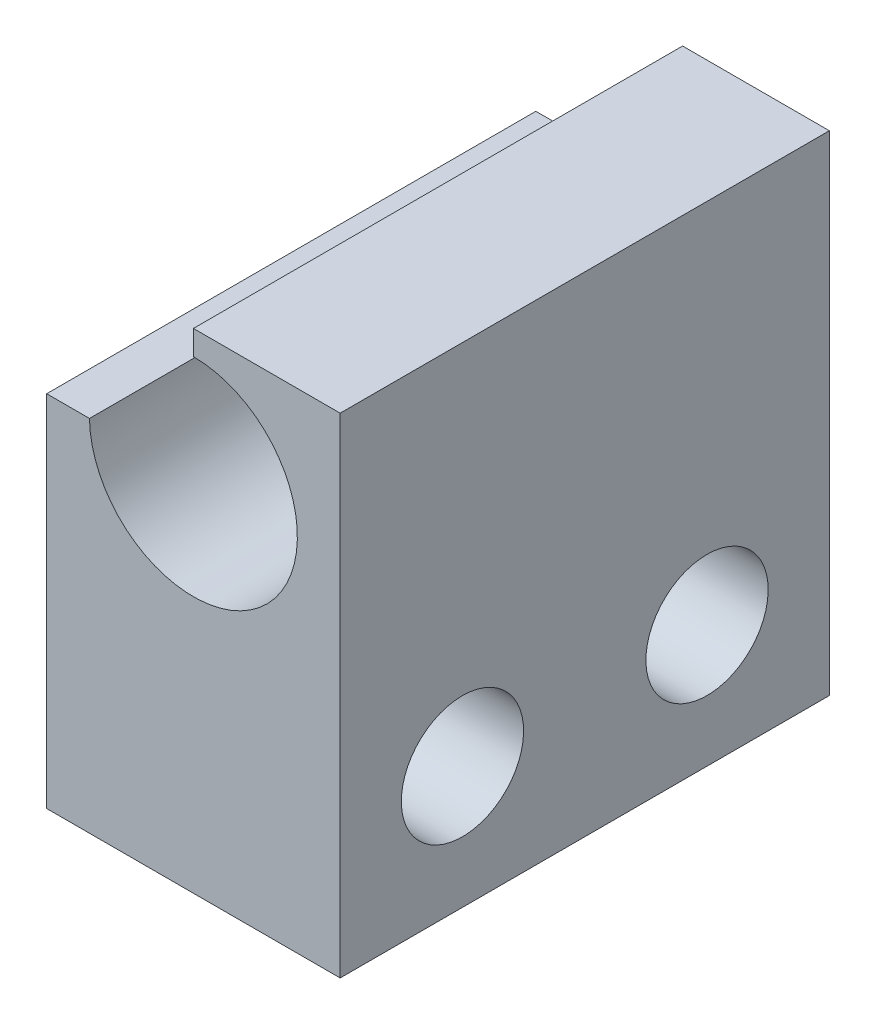
ISO-10303-21;
HEADER;
FILE_DESCRIPTION(('STEP AP214'),'2;1');
FILE_NAME('part.step','',(''),(''),'','','');
FILE_SCHEMA(('AUTOMOTIVE_DESIGN { 1 0 10303 214 1 1 1 1 }'));
ENDSEC;
DATA;
#1=APPLICATION_CONTEXT('core data for automotive mechanical design processes');
#2=APPLICATION_PROTOCOL_DEFINITION('international standard','automotive_design',2000,#1);
#3=PRODUCT_CONTEXT('',#1,'mechanical');
#4=PRODUCT('Part','Part','',(#3));
#5=PRODUCT_RELATED_PRODUCT_CATEGORY('part','',(#4));
#6=PRODUCT_DEFINITION_FORMATION('','',#4);
#7=PRODUCT_DEFINITION_CONTEXT('part definition',#1,'design');
#8=PRODUCT_DEFINITION('design','',#6,#7);
#9=PRODUCT_DEFINITION_SHAPE('','',#8);
#10=(LENGTH_UNIT() NAMED_UNIT(*) SI_UNIT(.MILLI.,.METRE.));
#11=(NAMED_UNIT(*) PLANE_ANGLE_UNIT() SI_UNIT($,.RADIAN.));
#12=(NAMED_UNIT(*) SI_UNIT($,.STERADIAN.) SOLID_ANGLE_UNIT());
#13=UNCERTAINTY_MEASURE_WITH_UNIT(LENGTH_MEASURE(1.E-05),#10,'distance_accuracy_value','');
#14=(GEOMETRIC_REPRESENTATION_CONTEXT(3) GLOBAL_UNCERTAINTY_ASSIGNED_CONTEXT((#13)) GLOBAL_UNIT_ASSIGNED_CONTEXT((#10,
#11,#12)) REPRESENTATION_CONTEXT('',''));
#15=CARTESIAN_POINT('',(0.,0.,0.));
#16=DIRECTION('',(0.,0.,1.));
#17=DIRECTION('',(1.,0.,0.));
#18=AXIS2_PLACEMENT_3D('',#15,#16,#17);
#19=CARTESIAN_POINT('',(-3.61398782119335,10.7259622854869,25.4));
#20=DIRECTION('',(0.,0.,-1.));
#21=DIRECTION('',(-1.,0.,0.));
#22=AXIS2_PLACEMENT_3D('',#19,#20,#21);
#23=CYLINDRICAL_SURFACE('',#22,5.3975);
#24=CARTESIAN_POINT('',(-3.61398782119335,10.7259622854869,0.));
#25=DIRECTION('',(0.,0.,-1.));
#26=DIRECTION('',(1.,0.,0.));
#27=AXIS2_PLACEMENT_3D('',#24,#25,#26);
#28=CIRCLE('',#27,5.3975);
#29=CARTESIAN_POINT('',(-3.61398782119336,16.1234622854869,0.));
#30=VERTEX_POINT('',#29);
#31=CARTESIAN_POINT('',(-9.01092004822007,10.647675716521,0.));
#32=VERTEX_POINT('',#31);
#33=EDGE_CURVE('E128',#30,#32,#28,.T.);
#34=ORIENTED_EDGE('',*,*,#33,.T.);
#35=DIRECTION('',(0.,0.,-1.));
#36=VECTOR('',#35,1.);
#37=CARTESIAN_POINT('',(-9.01092004822007,10.647675716521,25.4));
#38=LINE('',#37,#36);
#39=CARTESIAN_POINT('',(-9.01092004822007,10.647675716521,25.4));
#40=VERTEX_POINT('',#39);
#41=EDGE_CURVE('E11',#40,#32,#38,.T.);
#42=ORIENTED_EDGE('',*,*,#41,.F.);
#43=CARTESIAN_POINT('',(-3.61398782119335,10.7259622854869,25.4));
#44=DIRECTION('',(0.,0.,-1.));
#45=DIRECTION('',(1.,0.,0.));
#46=AXIS2_PLACEMENT_3D('',#43,#44,#45);
#47=CIRCLE('',#46,5.3975);
#48=CARTESIAN_POINT('',(-3.61398782119336,16.1234622854869,25.4));
#49=VERTEX_POINT('',#48);
#50=EDGE_CURVE('E141',#49,#40,#47,.T.);
#51=ORIENTED_EDGE('',*,*,#50,.F.);
#52=DIRECTION('',(0.,0.,-1.));
#53=VECTOR('',#52,1.);
#54=CARTESIAN_POINT('',(-3.61398782119336,16.1234622854869,25.4));
#55=LINE('',#54,#53);
#56=EDGE_CURVE('E124',#49,#30,#55,.T.);
#57=ORIENTED_EDGE('',*,*,#56,.T.);
#58=EDGE_LOOP('',(#34,#42,#51,#57));
#59=FACE_BOUND('',#58,.T.);
#60=ADVANCED_FACE('F38',(#59),#23,.F.);
#61=CARTESIAN_POINT('',(-9.01092004822007,10.647675716521,25.4));
#62=DIRECTION('',(0.,-1.,0.));
#63=DIRECTION('',(0.,0.,-1.));
#64=AXIS2_PLACEMENT_3D('',#61,#62,#63);
#65=PLANE('',#64);
#66=DIRECTION('',(-1.,0.,0.));
#67=VECTOR('',#66,1.);
#68=CARTESIAN_POINT('',(-9.01092004822007,10.647675716521,0.));
#69=LINE('',#68,#67);
#70=CARTESIAN_POINT('',(-11.2339878211934,10.647675716521,0.));
#71=VERTEX_POINT('',#70);
#72=EDGE_CURVE('E131',#32,#71,#69,.T.);
#73=ORIENTED_EDGE('',*,*,#72,.T.);
#74=DIRECTION('',(0.,0.,-1.));
#75=VECTOR('',#74,1.);
#76=CARTESIAN_POINT('',(-11.2339878211934,10.647675716521,25.4));
#77=LINE('',#76,#75);
#78=CARTESIAN_POINT('',(-11.2339878211934,10.647675716521,25.4));
#79=VERTEX_POINT('',#78);
#80=EDGE_CURVE('E46',#79,#71,#77,.T.);
#81=ORIENTED_EDGE('',*,*,#80,.F.);
#82=DIRECTION('',(-1.,0.,0.));
#83=VECTOR('',#82,1.);
#84=CARTESIAN_POINT('',(-9.01092004822007,10.647675716521,25.4));
#85=LINE('',#84,#83);
#86=EDGE_CURVE('E94',#40,#79,#85,.T.);
#87=ORIENTED_EDGE('',*,*,#86,.F.);
#88=ORIENTED_EDGE('',*,*,#41,.T.);
#89=EDGE_LOOP('',(#73,#81,#87,#88));
#90=FACE_BOUND('',#89,.T.);
#91=ADVANCED_FACE('F191',(#90),#65,.F.);
#92=CARTESIAN_POINT('',(-11.2339878211934,10.647675716521,25.4));
#93=DIRECTION('',(1.,0.,0.));
#94=DIRECTION('',(0.,1.,0.));
#95=AXIS2_PLACEMENT_3D('',#92,#93,#94);
#96=PLANE('',#95);
#97=CARTESIAN_POINT('',(-11.2339878211934,-1.65653771451314,19.05));
#98=DIRECTION('',(1.,0.,0.));
#99=DIRECTION('',(0.,1.,0.));
#100=AXIS2_PLACEMENT_3D('',#97,#98,#99);
#101=CIRCLE('',#100,3.175);
#102=CARTESIAN_POINT('',(-11.2339878211934,1.51846228548686,19.05));
#103=VERTEX_POINT('',#102);
#104=EDGE_CURVE('E132',#103,#103,#101,.T.);
#105=ORIENTED_EDGE('',*,*,#104,.T.);
#106=EDGE_LOOP('',(#105));
#107=FACE_BOUND('',#106,.T.);
#108=CARTESIAN_POINT('',(-11.2339878211934,-1.65653771451314,6.35));
#109=DIRECTION('',(1.,0.,0.));
#110=DIRECTION('',(0.,1.,0.));
#111=AXIS2_PLACEMENT_3D('',#108,#109,#110);
#112=CIRCLE('',#111,3.175);
#113=CARTESIAN_POINT('',(-11.2339878211934,1.51846228548686,6.35));
#114=VERTEX_POINT('',#113);
#115=EDGE_CURVE('E166',#114,#114,#112,.T.);
#116=ORIENTED_EDGE('',*,*,#115,.T.);
#117=EDGE_LOOP('',(#116));
#118=FACE_BOUND('',#117,.T.);
#119=DIRECTION('',(0.,-1.,0.));
#120=VECTOR('',#119,1.);
#121=CARTESIAN_POINT('',(-11.2339878211934,10.647675716521,0.));
#122=LINE('',#121,#120);
#123=CARTESIAN_POINT('',(-11.2339878211934,-8.00653771451314,0.));
#124=VERTEX_POINT('',#123);
#125=EDGE_CURVE('E134',#71,#124,#122,.T.);
#126=ORIENTED_EDGE('',*,*,#125,.T.);
#127=DIRECTION('',(0.,0.,-1.));
#128=VECTOR('',#127,1.);
#129=CARTESIAN_POINT('',(-11.2339878211934,-8.00653771451314,25.4));
#130=LINE('',#129,#128);
#131=CARTESIAN_POINT('',(-11.2339878211934,-8.00653771451314,25.4));
#132=VERTEX_POINT('',#131);
#133=EDGE_CURVE('E145',#132,#124,#130,.T.);
#134=ORIENTED_EDGE('',*,*,#133,.F.);
#135=DIRECTION('',(0.,-1.,0.));
#136=VECTOR('',#135,1.);
#137=CARTESIAN_POINT('',(-11.2339878211934,10.647675716521,25.4));
#138=LINE('',#137,#136);
#139=EDGE_CURVE('E153',#79,#132,#138,.T.);
#140=ORIENTED_EDGE('',*,*,#139,.F.);
#141=ORIENTED_EDGE('',*,*,#80,.T.);
#142=EDGE_LOOP('',(#126,#134,#140,#141));
#143=FACE_BOUND('',#142,.T.);
#144=ADVANCED_FACE('F151',(#107,#118,#143),#96,.F.);
#145=CARTESIAN_POINT('',(-11.2339878211934,-8.00653771451314,25.4));
#146=DIRECTION('',(0.,1.,0.));
#147=DIRECTION('',(0.,0.,1.));
#148=AXIS2_PLACEMENT_3D('',#145,#146,#147);
#149=PLANE('',#148);
#150=DIRECTION('',(1.,0.,0.));
#151=VECTOR('',#150,1.);
#152=CARTESIAN_POINT('',(-11.2339878211934,-8.00653771451314,0.));
#153=LINE('',#152,#151);
#154=CARTESIAN_POINT('',(4.00601217880664,-8.00653771451314,0.));
#155=VERTEX_POINT('',#154);
#156=EDGE_CURVE('E136',#124,#155,#153,.T.);
#157=ORIENTED_EDGE('',*,*,#156,.T.);
#158=DIRECTION('',(0.,0.,-1.));
#159=VECTOR('',#158,1.);
#160=CARTESIAN_POINT('',(4.00601217880664,-8.00653771451314,25.4));
#161=LINE('',#160,#159);
#162=CARTESIAN_POINT('',(4.00601217880664,-8.00653771451314,25.4));
#163=VERTEX_POINT('',#162);
#164=EDGE_CURVE('E119',#163,#155,#161,.T.);
#165=ORIENTED_EDGE('',*,*,#164,.F.);
#166=DIRECTION('',(1.,0.,0.));
#167=VECTOR('',#166,1.);
#168=CARTESIAN_POINT('',(-11.2339878211934,-8.00653771451314,25.4));
#169=LINE('',#168,#167);
#170=EDGE_CURVE('E110',#132,#163,#169,.T.);
#171=ORIENTED_EDGE('',*,*,#170,.F.);
#172=ORIENTED_EDGE('',*,*,#133,.T.);
#173=EDGE_LOOP('',(#157,#165,#171,#172));
#174=FACE_BOUND('',#173,.T.);
#175=ADVANCED_FACE('F159',(#174),#149,.F.);
#176=CARTESIAN_POINT('',(4.00601217880664,-8.00653771451314,25.4));
#177=DIRECTION('',(-1.,0.,0.));
#178=DIRECTION('',(0.,-1.,0.));
#179=AXIS2_PLACEMENT_3D('',#176,#177,#178);
#180=PLANE('',#179);
#181=CARTESIAN_POINT('',(4.00601217880664,-1.65653771451314,19.05));
#182=DIRECTION('',(1.,0.,0.));
#183=DIRECTION('',(0.,1.,0.));
#184=AXIS2_PLACEMENT_3D('',#181,#182,#183);
#185=CIRCLE('',#184,3.175);
#186=CARTESIAN_POINT('',(4.00601217880664,1.51846228548686,19.05));
#187=VERTEX_POINT('',#186);
#188=EDGE_CURVE('E169',#187,#187,#185,.T.);
#189=ORIENTED_EDGE('',*,*,#188,.F.);
#190=EDGE_LOOP('',(#189));
#191=FACE_BOUND('',#190,.T.);
#192=CARTESIAN_POINT('',(4.00601217880664,-1.65653771451314,6.35));
#193=DIRECTION('',(1.,0.,0.));
#194=DIRECTION('',(0.,1.,0.));
#195=AXIS2_PLACEMENT_3D('',#192,#193,#194);
#196=CIRCLE('',#195,3.175);
#197=CARTESIAN_POINT('',(4.00601217880664,1.51846228548686,6.35));
#198=VERTEX_POINT('',#197);
#199=EDGE_CURVE('E170',#198,#198,#196,.T.);
#200=ORIENTED_EDGE('',*,*,#199,.F.);
#201=EDGE_LOOP('',(#200));
#202=FACE_BOUND('',#201,.T.);
#203=DIRECTION('',(0.,1.,0.));
#204=VECTOR('',#203,1.);
#205=CARTESIAN_POINT('',(4.00601217880664,-8.00653771451314,0.));
#206=LINE('',#205,#204);
#207=CARTESIAN_POINT('',(4.00601217880664,17.3934622854869,0.));
#208=VERTEX_POINT('',#207);
#209=EDGE_CURVE('E118',#155,#208,#206,.T.);
#210=ORIENTED_EDGE('',*,*,#209,.T.);
#211=DIRECTION('',(0.,0.,-1.));
#212=VECTOR('',#211,1.);
#213=CARTESIAN_POINT('',(4.00601217880664,17.3934622854869,25.4));
#214=LINE('',#213,#212);
#215=CARTESIAN_POINT('',(4.00601217880664,17.3934622854869,25.4));
#216=VERTEX_POINT('',#215);
#217=EDGE_CURVE('E115',#216,#208,#214,.T.);
#218=ORIENTED_EDGE('',*,*,#217,.F.);
#219=DIRECTION('',(0.,1.,0.));
#220=VECTOR('',#219,1.);
#221=CARTESIAN_POINT('',(4.00601217880664,-8.00653771451314,25.4));
#222=LINE('',#221,#220);
#223=EDGE_CURVE('E104',#163,#216,#222,.T.);
#224=ORIENTED_EDGE('',*,*,#223,.F.);
#225=ORIENTED_EDGE('',*,*,#164,.T.);
#226=EDGE_LOOP('',(#210,#218,#224,#225));
#227=FACE_BOUND('',#226,.T.);
#228=ADVANCED_FACE('F116',(#191,#202,#227),#180,.F.);
#229=CARTESIAN_POINT('',(4.00601217880664,17.3934622854869,25.4));
#230=DIRECTION('',(0.,-1.,0.));
#231=DIRECTION('',(0.,0.,-1.));
#232=AXIS2_PLACEMENT_3D('',#229,#230,#231);
#233=PLANE('',#232);
#234=DIRECTION('',(-1.,0.,0.));
#235=VECTOR('',#234,1.);
#236=CARTESIAN_POINT('',(4.00601217880664,17.3934622854869,0.));
#237=LINE('',#236,#235);
#238=CARTESIAN_POINT('',(-3.61398782119336,17.3934622854869,0.));
#239=VERTEX_POINT('',#238);
#240=EDGE_CURVE('E80',#208,#239,#237,.T.);
#241=ORIENTED_EDGE('',*,*,#240,.T.);
#242=DIRECTION('',(0.,0.,-1.));
#243=VECTOR('',#242,1.);
#244=CARTESIAN_POINT('',(-3.61398782119336,17.3934622854869,25.4));
#245=LINE('',#244,#243);
#246=CARTESIAN_POINT('',(-3.61398782119336,17.3934622854869,25.4));
#247=VERTEX_POINT('',#246);
#248=EDGE_CURVE('E120',#247,#239,#245,.T.);
#249=ORIENTED_EDGE('',*,*,#248,.F.);
#250=DIRECTION('',(-1.,0.,0.));
#251=VECTOR('',#250,1.);
#252=CARTESIAN_POINT('',(4.00601217880664,17.3934622854869,25.4));
#253=LINE('',#252,#251);
#254=EDGE_CURVE('E108',#216,#247,#253,.T.);
#255=ORIENTED_EDGE('',*,*,#254,.F.);
#256=ORIENTED_EDGE('',*,*,#217,.T.);
#257=EDGE_LOOP('',(#241,#249,#255,#256));
#258=FACE_BOUND('',#257,.T.);
#259=ADVANCED_FACE('F122',(#258),#233,.F.);
#260=CARTESIAN_POINT('',(-3.61398782119336,17.3934622854869,25.4));
#261=DIRECTION('',(1.,0.,0.));
#262=DIRECTION('',(0.,1.,0.));
#263=AXIS2_PLACEMENT_3D('',#260,#261,#262);
#264=PLANE('',#263);
#265=DIRECTION('',(0.,-1.,0.));
#266=VECTOR('',#265,1.);
#267=CARTESIAN_POINT('',(-3.61398782119336,17.3934622854869,0.));
#268=LINE('',#267,#266);
#269=EDGE_CURVE('E86',#239,#30,#268,.T.);
#270=ORIENTED_EDGE('',*,*,#269,.T.);
#271=ORIENTED_EDGE('',*,*,#56,.F.);
#272=DIRECTION('',(0.,-1.,0.));
#273=VECTOR('',#272,1.);
#274=CARTESIAN_POINT('',(-3.61398782119336,17.3934622854869,25.4));
#275=LINE('',#274,#273);
#276=EDGE_CURVE('E54',#247,#49,#275,.T.);
#277=ORIENTED_EDGE('',*,*,#276,.F.);
#278=ORIENTED_EDGE('',*,*,#248,.T.);
#279=EDGE_LOOP('',(#270,#271,#277,#278));
#280=FACE_BOUND('',#279,.T.);
#281=ADVANCED_FACE('F205',(#280),#264,.F.);
#282=CARTESIAN_POINT('',(-3.61398782119335,10.7259622854869,25.4));
#283=DIRECTION('',(0.,0.,1.));
#284=DIRECTION('',(1.,0.,0.));
#285=AXIS2_PLACEMENT_3D('',#282,#283,#284);
#286=PLANE('',#285);
#287=ORIENTED_EDGE('',*,*,#50,.T.);
#288=ORIENTED_EDGE('',*,*,#86,.T.);
#289=ORIENTED_EDGE('',*,*,#139,.T.);
#290=ORIENTED_EDGE('',*,*,#170,.T.);
#291=ORIENTED_EDGE('',*,*,#223,.T.);
#292=ORIENTED_EDGE('',*,*,#254,.T.);
#293=ORIENTED_EDGE('',*,*,#276,.T.);
#294=EDGE_LOOP('',(#287,#288,#289,#290,#291,#292,#293));
#295=FACE_BOUND('',#294,.T.);
#296=ADVANCED_FACE('F106',(#295),#286,.T.);
#297=CARTESIAN_POINT('',(-3.61398782119335,10.7259622854869,0.));
#298=DIRECTION('',(0.,0.,1.));
#299=DIRECTION('',(1.,0.,0.));
#300=AXIS2_PLACEMENT_3D('',#297,#298,#299);
#301=PLANE('',#300);
#302=ORIENTED_EDGE('',*,*,#33,.F.);
#303=ORIENTED_EDGE('',*,*,#269,.F.);
#304=ORIENTED_EDGE('',*,*,#240,.F.);
#305=ORIENTED_EDGE('',*,*,#209,.F.);
#306=ORIENTED_EDGE('',*,*,#156,.F.);
#307=ORIENTED_EDGE('',*,*,#125,.F.);
#308=ORIENTED_EDGE('',*,*,#72,.F.);
#309=EDGE_LOOP('',(#302,#303,#304,#305,#306,#307,#308));
#310=FACE_BOUND('',#309,.T.);
#311=ADVANCED_FACE('F157',(#310),#301,.F.);
#312=CARTESIAN_POINT('',(-21.3939878211934,-1.65653771451314,6.35));
#313=DIRECTION('',(1.,0.,0.));
#314=DIRECTION('',(0.,1.,0.));
#315=AXIS2_PLACEMENT_3D('',#312,#313,#314);
#316=CYLINDRICAL_SURFACE('',#315,3.175);
#317=ORIENTED_EDGE('',*,*,#199,.T.);
#318=EDGE_LOOP('',(#317));
#319=FACE_BOUND('',#318,.T.);
#320=ORIENTED_EDGE('',*,*,#115,.F.);
#321=EDGE_LOOP('',(#320));
#322=FACE_BOUND('',#321,.T.);
#323=ADVANCED_FACE('F184',(#319,#322),#316,.F.);
#324=CARTESIAN_POINT('',(-21.3939878211934,-1.65653771451314,19.05));
#325=DIRECTION('',(1.,0.,0.));
#326=DIRECTION('',(0.,1.,0.));
#327=AXIS2_PLACEMENT_3D('',#324,#325,#326);
#328=CYLINDRICAL_SURFACE('',#327,3.175);
#329=ORIENTED_EDGE('',*,*,#188,.T.);
#330=EDGE_LOOP('',(#329));
#331=FACE_BOUND('',#330,.T.);
#332=ORIENTED_EDGE('',*,*,#104,.F.);
#333=EDGE_LOOP('',(#332));
#334=FACE_BOUND('',#333,.T.);
#335=ADVANCED_FACE('F176',(#331,#334),#328,.F.);
#336=CLOSED_SHELL('',(#60,#91,#144,#175,#228,#259,#281,#296,#311,#323,#335));
#337=MANIFOLD_SOLID_BREP('B2',#336);
#338=ADVANCED_BREP_SHAPE_REPRESENTATION('',(#18,#337),#14);
#339=SHAPE_DEFINITION_REPRESENTATION(#9,#338);
ENDSEC;
END-ISO-10303-21;
